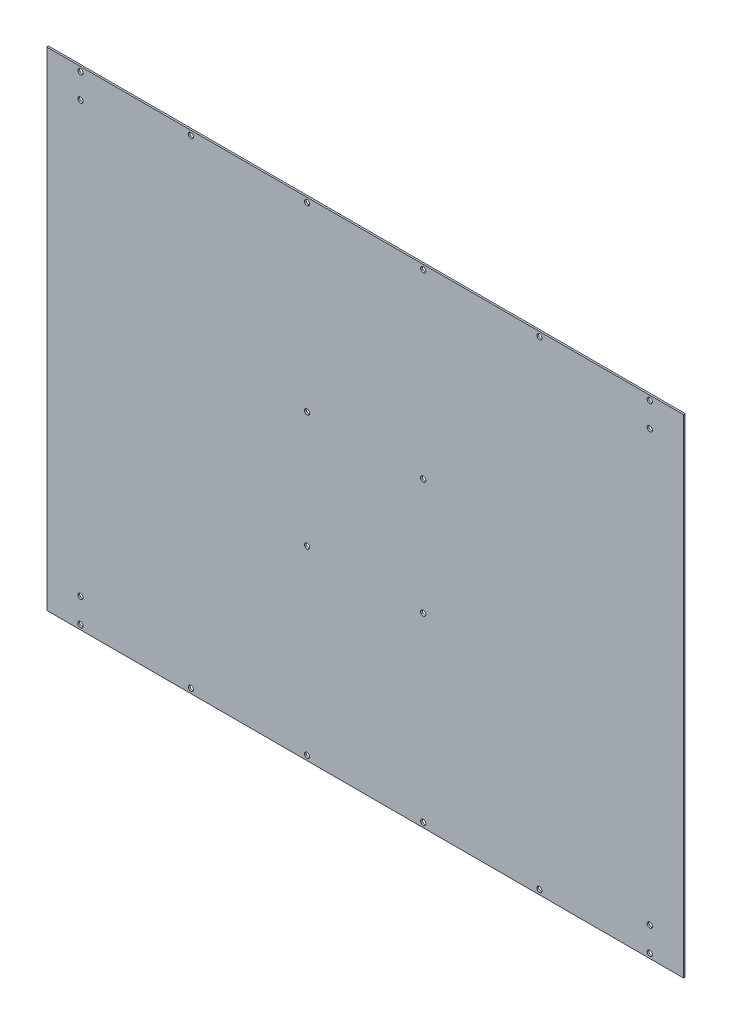
ISO-10303-21;
HEADER;
FILE_DESCRIPTION(('STEP AP214'),'2;1');
FILE_NAME('part.step','',(''),(''),'','','');
FILE_SCHEMA(('AUTOMOTIVE_DESIGN { 1 0 10303 214 1 1 1 1 }'));
ENDSEC;
DATA;
#1=APPLICATION_CONTEXT('core data for automotive mechanical design processes');
#2=APPLICATION_PROTOCOL_DEFINITION('international standard','automotive_design',2000,#1);
#3=PRODUCT_CONTEXT('',#1,'mechanical');
#4=PRODUCT('Part','Part','',(#3));
#5=PRODUCT_RELATED_PRODUCT_CATEGORY('part','',(#4));
#6=PRODUCT_DEFINITION_FORMATION('','',#4);
#7=PRODUCT_DEFINITION_CONTEXT('part definition',#1,'design');
#8=PRODUCT_DEFINITION('design','',#6,#7);
#9=PRODUCT_DEFINITION_SHAPE('','',#8);
#10=(LENGTH_UNIT() NAMED_UNIT(*) SI_UNIT(.MILLI.,.METRE.));
#11=(NAMED_UNIT(*) PLANE_ANGLE_UNIT() SI_UNIT($,.RADIAN.));
#12=(NAMED_UNIT(*) SI_UNIT($,.STERADIAN.) SOLID_ANGLE_UNIT());
#13=UNCERTAINTY_MEASURE_WITH_UNIT(LENGTH_MEASURE(1.E-05),#10,'distance_accuracy_value','');
#14=(GEOMETRIC_REPRESENTATION_CONTEXT(3) GLOBAL_UNCERTAINTY_ASSIGNED_CONTEXT((#13)) GLOBAL_UNIT_ASSIGNED_CONTEXT((#10,
#11,#12)) REPRESENTATION_CONTEXT('',''));
#15=CARTESIAN_POINT('',(0.,0.,0.));
#16=DIRECTION('',(0.,0.,1.));
#17=DIRECTION('',(1.,0.,0.));
#18=AXIS2_PLACEMENT_3D('',#15,#16,#17);
#19=CARTESIAN_POINT('',(0.,0.,110.));
#20=DIRECTION('',(0.,0.,1.));
#21=DIRECTION('',(1.,0.,0.));
#22=AXIS2_PLACEMENT_3D('',#19,#20,#21);
#23=PLANE('',#22);
#24=CARTESIAN_POINT('',(245.,185.,110.));
#25=DIRECTION('',(0.,0.,1.));
#26=DIRECTION('',(1.,0.,0.));
#27=AXIS2_PLACEMENT_3D('',#24,#25,#26);
#28=CIRCLE('',#27,2.25);
#29=CARTESIAN_POINT('',(247.25,185.,110.));
#30=VERTEX_POINT('',#29);
#31=EDGE_CURVE('E199',#30,#30,#28,.T.);
#32=ORIENTED_EDGE('',*,*,#31,.F.);
#33=EDGE_LOOP('',(#32));
#34=FACE_BOUND('',#33,.T.);
#35=CARTESIAN_POINT('',(245.,-185.,110.));
#36=DIRECTION('',(0.,0.,1.));
#37=DIRECTION('',(1.,0.,0.));
#38=AXIS2_PLACEMENT_3D('',#35,#36,#37);
#39=CIRCLE('',#38,2.25);
#40=CARTESIAN_POINT('',(247.25,-185.,110.));
#41=VERTEX_POINT('',#40);
#42=EDGE_CURVE('E196',#41,#41,#39,.T.);
#43=ORIENTED_EDGE('',*,*,#42,.F.);
#44=EDGE_LOOP('',(#43));
#45=FACE_BOUND('',#44,.T.);
#46=CARTESIAN_POINT('',(-245.,185.,110.));
#47=DIRECTION('',(0.,0.,1.));
#48=DIRECTION('',(1.,0.,0.));
#49=AXIS2_PLACEMENT_3D('',#46,#47,#48);
#50=CIRCLE('',#49,2.25);
#51=CARTESIAN_POINT('',(-242.75,185.,110.));
#52=VERTEX_POINT('',#51);
#53=EDGE_CURVE('E192',#52,#52,#50,.T.);
#54=ORIENTED_EDGE('',*,*,#53,.F.);
#55=EDGE_LOOP('',(#54));
#56=FACE_BOUND('',#55,.T.);
#57=CARTESIAN_POINT('',(-245.,-185.,110.));
#58=DIRECTION('',(0.,0.,1.));
#59=DIRECTION('',(1.,0.,0.));
#60=AXIS2_PLACEMENT_3D('',#57,#58,#59);
#61=CIRCLE('',#60,2.25);
#62=CARTESIAN_POINT('',(-242.75,-185.,110.));
#63=VERTEX_POINT('',#62);
#64=EDGE_CURVE('E187',#63,#63,#61,.T.);
#65=ORIENTED_EDGE('',*,*,#64,.F.);
#66=EDGE_LOOP('',(#65));
#67=FACE_BOUND('',#66,.T.);
#68=CARTESIAN_POINT('',(245.,206.,110.));
#69=DIRECTION('',(0.,0.,1.));
#70=DIRECTION('',(1.,0.,0.));
#71=AXIS2_PLACEMENT_3D('',#68,#69,#70);
#72=CIRCLE('',#71,2.25);
#73=CARTESIAN_POINT('',(247.25,206.,110.));
#74=VERTEX_POINT('',#73);
#75=EDGE_CURVE('E182',#74,#74,#72,.T.);
#76=ORIENTED_EDGE('',*,*,#75,.F.);
#77=EDGE_LOOP('',(#76));
#78=FACE_BOUND('',#77,.T.);
#79=CARTESIAN_POINT('',(245.,-206.,110.));
#80=DIRECTION('',(0.,0.,1.));
#81=DIRECTION('',(1.,0.,0.));
#82=AXIS2_PLACEMENT_3D('',#79,#80,#81);
#83=CIRCLE('',#82,2.25);
#84=CARTESIAN_POINT('',(247.25,-206.,110.));
#85=VERTEX_POINT('',#84);
#86=EDGE_CURVE('E177',#85,#85,#83,.T.);
#87=ORIENTED_EDGE('',*,*,#86,.F.);
#88=EDGE_LOOP('',(#87));
#89=FACE_BOUND('',#88,.T.);
#90=CARTESIAN_POINT('',(150.,206.,110.));
#91=DIRECTION('',(0.,0.,1.));
#92=DIRECTION('',(1.,0.,0.));
#93=AXIS2_PLACEMENT_3D('',#90,#91,#92);
#94=CIRCLE('',#93,2.25);
#95=CARTESIAN_POINT('',(152.25,206.,110.));
#96=VERTEX_POINT('',#95);
#97=EDGE_CURVE('E172',#96,#96,#94,.T.);
#98=ORIENTED_EDGE('',*,*,#97,.F.);
#99=EDGE_LOOP('',(#98));
#100=FACE_BOUND('',#99,.T.);
#101=CARTESIAN_POINT('',(150.,-206.,110.));
#102=DIRECTION('',(0.,0.,1.));
#103=DIRECTION('',(1.,0.,0.));
#104=AXIS2_PLACEMENT_3D('',#101,#102,#103);
#105=CIRCLE('',#104,2.25);
#106=CARTESIAN_POINT('',(152.25,-206.,110.));
#107=VERTEX_POINT('',#106);
#108=EDGE_CURVE('E167',#107,#107,#105,.T.);
#109=ORIENTED_EDGE('',*,*,#108,.F.);
#110=EDGE_LOOP('',(#109));
#111=FACE_BOUND('',#110,.T.);
#112=CARTESIAN_POINT('',(50.,206.,110.));
#113=DIRECTION('',(0.,0.,1.));
#114=DIRECTION('',(1.,0.,0.));
#115=AXIS2_PLACEMENT_3D('',#112,#113,#114);
#116=CIRCLE('',#115,2.25);
#117=CARTESIAN_POINT('',(52.25,206.,110.));
#118=VERTEX_POINT('',#117);
#119=EDGE_CURVE('E162',#118,#118,#116,.T.);
#120=ORIENTED_EDGE('',*,*,#119,.F.);
#121=EDGE_LOOP('',(#120));
#122=FACE_BOUND('',#121,.T.);
#123=CARTESIAN_POINT('',(50.,-206.,110.));
#124=DIRECTION('',(0.,0.,1.));
#125=DIRECTION('',(1.,0.,0.));
#126=AXIS2_PLACEMENT_3D('',#123,#124,#125);
#127=CIRCLE('',#126,2.25);
#128=CARTESIAN_POINT('',(52.25,-206.,110.));
#129=VERTEX_POINT('',#128);
#130=EDGE_CURVE('E157',#129,#129,#127,.T.);
#131=ORIENTED_EDGE('',*,*,#130,.F.);
#132=EDGE_LOOP('',(#131));
#133=FACE_BOUND('',#132,.T.);
#134=CARTESIAN_POINT('',(-50.,206.,110.));
#135=DIRECTION('',(0.,0.,1.));
#136=DIRECTION('',(1.,0.,0.));
#137=AXIS2_PLACEMENT_3D('',#134,#135,#136);
#138=CIRCLE('',#137,2.25);
#139=CARTESIAN_POINT('',(-47.75,206.,110.));
#140=VERTEX_POINT('',#139);
#141=EDGE_CURVE('E152',#140,#140,#138,.T.);
#142=ORIENTED_EDGE('',*,*,#141,.F.);
#143=EDGE_LOOP('',(#142));
#144=FACE_BOUND('',#143,.T.);
#145=CARTESIAN_POINT('',(-50.,-206.,110.));
#146=DIRECTION('',(0.,0.,1.));
#147=DIRECTION('',(1.,0.,0.));
#148=AXIS2_PLACEMENT_3D('',#145,#146,#147);
#149=CIRCLE('',#148,2.25);
#150=CARTESIAN_POINT('',(-47.75,-206.,110.));
#151=VERTEX_POINT('',#150);
#152=EDGE_CURVE('E147',#151,#151,#149,.T.);
#153=ORIENTED_EDGE('',*,*,#152,.F.);
#154=EDGE_LOOP('',(#153));
#155=FACE_BOUND('',#154,.T.);
#156=CARTESIAN_POINT('',(-150.,206.,110.));
#157=DIRECTION('',(0.,0.,1.));
#158=DIRECTION('',(1.,0.,0.));
#159=AXIS2_PLACEMENT_3D('',#156,#157,#158);
#160=CIRCLE('',#159,2.25);
#161=CARTESIAN_POINT('',(-147.75,206.,110.));
#162=VERTEX_POINT('',#161);
#163=EDGE_CURVE('E142',#162,#162,#160,.T.);
#164=ORIENTED_EDGE('',*,*,#163,.F.);
#165=EDGE_LOOP('',(#164));
#166=FACE_BOUND('',#165,.T.);
#167=CARTESIAN_POINT('',(-150.,-206.,110.));
#168=DIRECTION('',(0.,0.,1.));
#169=DIRECTION('',(1.,0.,0.));
#170=AXIS2_PLACEMENT_3D('',#167,#168,#169);
#171=CIRCLE('',#170,2.25);
#172=CARTESIAN_POINT('',(-147.75,-206.,110.));
#173=VERTEX_POINT('',#172);
#174=EDGE_CURVE('E137',#173,#173,#171,.T.);
#175=ORIENTED_EDGE('',*,*,#174,.F.);
#176=EDGE_LOOP('',(#175));
#177=FACE_BOUND('',#176,.T.);
#178=CARTESIAN_POINT('',(-245.,206.,110.));
#179=DIRECTION('',(0.,0.,1.));
#180=DIRECTION('',(1.,0.,0.));
#181=AXIS2_PLACEMENT_3D('',#178,#179,#180);
#182=CIRCLE('',#181,2.25);
#183=CARTESIAN_POINT('',(-242.75,206.,110.));
#184=VERTEX_POINT('',#183);
#185=EDGE_CURVE('E132',#184,#184,#182,.T.);
#186=ORIENTED_EDGE('',*,*,#185,.F.);
#187=EDGE_LOOP('',(#186));
#188=FACE_BOUND('',#187,.T.);
#189=CARTESIAN_POINT('',(-245.,-206.,110.));
#190=DIRECTION('',(0.,0.,1.));
#191=DIRECTION('',(1.,0.,0.));
#192=AXIS2_PLACEMENT_3D('',#189,#190,#191);
#193=CIRCLE('',#192,2.25);
#194=CARTESIAN_POINT('',(-242.75,-206.,110.));
#195=VERTEX_POINT('',#194);
#196=EDGE_CURVE('E127',#195,#195,#193,.T.);
#197=ORIENTED_EDGE('',*,*,#196,.F.);
#198=EDGE_LOOP('',(#197));
#199=FACE_BOUND('',#198,.T.);
#200=CARTESIAN_POINT('',(50.,50.,110.));
#201=DIRECTION('',(0.,0.,1.));
#202=DIRECTION('',(1.,0.,0.));
#203=AXIS2_PLACEMENT_3D('',#200,#201,#202);
#204=CIRCLE('',#203,2.25);
#205=CARTESIAN_POINT('',(52.25,50.,110.));
#206=VERTEX_POINT('',#205);
#207=EDGE_CURVE('E122',#206,#206,#204,.T.);
#208=ORIENTED_EDGE('',*,*,#207,.F.);
#209=EDGE_LOOP('',(#208));
#210=FACE_BOUND('',#209,.T.);
#211=CARTESIAN_POINT('',(50.,-50.,110.));
#212=DIRECTION('',(0.,0.,1.));
#213=DIRECTION('',(1.,0.,0.));
#214=AXIS2_PLACEMENT_3D('',#211,#212,#213);
#215=CIRCLE('',#214,2.25);
#216=CARTESIAN_POINT('',(52.25,-50.,110.));
#217=VERTEX_POINT('',#216);
#218=EDGE_CURVE('E117',#217,#217,#215,.T.);
#219=ORIENTED_EDGE('',*,*,#218,.F.);
#220=EDGE_LOOP('',(#219));
#221=FACE_BOUND('',#220,.T.);
#222=CARTESIAN_POINT('',(-50.,50.,110.));
#223=DIRECTION('',(0.,0.,1.));
#224=DIRECTION('',(1.,0.,0.));
#225=AXIS2_PLACEMENT_3D('',#222,#223,#224);
#226=CIRCLE('',#225,2.25);
#227=CARTESIAN_POINT('',(-47.75,50.,110.));
#228=VERTEX_POINT('',#227);
#229=EDGE_CURVE('E112',#228,#228,#226,.T.);
#230=ORIENTED_EDGE('',*,*,#229,.F.);
#231=EDGE_LOOP('',(#230));
#232=FACE_BOUND('',#231,.T.);
#233=CARTESIAN_POINT('',(-50.,-50.,110.));
#234=DIRECTION('',(0.,0.,1.));
#235=DIRECTION('',(1.,0.,0.));
#236=AXIS2_PLACEMENT_3D('',#233,#234,#235);
#237=CIRCLE('',#236,2.25);
#238=CARTESIAN_POINT('',(-47.75,-50.,110.));
#239=VERTEX_POINT('',#238);
#240=EDGE_CURVE('E76',#239,#239,#237,.T.);
#241=ORIENTED_EDGE('',*,*,#240,.F.);
#242=EDGE_LOOP('',(#241));
#243=FACE_BOUND('',#242,.T.);
#244=DIRECTION('',(-1.,0.,0.));
#245=VECTOR('',#244,1.);
#246=CARTESIAN_POINT('',(0.,-210.,110.));
#247=LINE('',#246,#245);
#248=CARTESIAN_POINT('',(274.,-210.,110.));
#249=VERTEX_POINT('',#248);
#250=CARTESIAN_POINT('',(-274.,-210.,110.));
#251=VERTEX_POINT('',#250);
#252=EDGE_CURVE('E10',#249,#251,#247,.T.);
#253=ORIENTED_EDGE('',*,*,#252,.F.);
#254=DIRECTION('',(0.,-1.,0.));
#255=VECTOR('',#254,1.);
#256=CARTESIAN_POINT('',(274.,0.,110.));
#257=LINE('',#256,#255);
#258=CARTESIAN_POINT('',(274.,210.,110.));
#259=VERTEX_POINT('',#258);
#260=EDGE_CURVE('E63',#259,#249,#257,.T.);
#261=ORIENTED_EDGE('',*,*,#260,.F.);
#262=DIRECTION('',(1.,0.,0.));
#263=VECTOR('',#262,1.);
#264=CARTESIAN_POINT('',(0.,210.,110.));
#265=LINE('',#264,#263);
#266=CARTESIAN_POINT('',(-274.,210.,110.));
#267=VERTEX_POINT('',#266);
#268=EDGE_CURVE('E103',#267,#259,#265,.T.);
#269=ORIENTED_EDGE('',*,*,#268,.F.);
#270=DIRECTION('',(0.,1.,0.));
#271=VECTOR('',#270,1.);
#272=CARTESIAN_POINT('',(-274.,0.,110.));
#273=LINE('',#272,#271);
#274=EDGE_CURVE('E25',#251,#267,#273,.T.);
#275=ORIENTED_EDGE('',*,*,#274,.F.);
#276=EDGE_LOOP('',(#253,#261,#269,#275));
#277=FACE_BOUND('',#276,.T.);
#278=ADVANCED_FACE('F16',(#34,#45,#56,#67,#78,#89,#100,#111,#122,#133,#144,#155,#166,#177,#188,
#199,#210,#221,#232,#243,#277),#23,.T.);
#279=CARTESIAN_POINT('',(0.,-210.,108.5));
#280=DIRECTION('',(0.,-1.,0.));
#281=DIRECTION('',(0.,0.,-1.));
#282=AXIS2_PLACEMENT_3D('',#279,#280,#281);
#283=PLANE('',#282);
#284=DIRECTION('',(0.,0.,1.));
#285=VECTOR('',#284,1.);
#286=CARTESIAN_POINT('',(274.,-210.,108.5));
#287=LINE('',#286,#285);
#288=CARTESIAN_POINT('',(274.,-210.,108.5));
#289=VERTEX_POINT('',#288);
#290=EDGE_CURVE('E56',#289,#249,#287,.T.);
#291=ORIENTED_EDGE('',*,*,#290,.T.);
#292=ORIENTED_EDGE('',*,*,#252,.T.);
#293=DIRECTION('',(0.,0.,1.));
#294=VECTOR('',#293,1.);
#295=CARTESIAN_POINT('',(-274.,-210.,108.5));
#296=LINE('',#295,#294);
#297=CARTESIAN_POINT('',(-274.,-210.,108.5));
#298=VERTEX_POINT('',#297);
#299=EDGE_CURVE('E70',#298,#251,#296,.T.);
#300=ORIENTED_EDGE('',*,*,#299,.F.);
#301=DIRECTION('',(1.,0.,0.));
#302=VECTOR('',#301,1.);
#303=CARTESIAN_POINT('',(0.,-210.,108.5));
#304=LINE('',#303,#302);
#305=EDGE_CURVE('E68',#298,#289,#304,.T.);
#306=ORIENTED_EDGE('',*,*,#305,.T.);
#307=EDGE_LOOP('',(#291,#292,#300,#306));
#308=FACE_BOUND('',#307,.T.);
#309=ADVANCED_FACE('F69',(#308),#283,.T.);
#310=CARTESIAN_POINT('',(-274.,0.,108.5));
#311=DIRECTION('',(-1.,0.,0.));
#312=DIRECTION('',(0.,0.,1.));
#313=AXIS2_PLACEMENT_3D('',#310,#311,#312);
#314=PLANE('',#313);
#315=ORIENTED_EDGE('',*,*,#299,.T.);
#316=ORIENTED_EDGE('',*,*,#274,.T.);
#317=DIRECTION('',(0.,0.,1.));
#318=VECTOR('',#317,1.);
#319=CARTESIAN_POINT('',(-274.,210.,108.5));
#320=LINE('',#319,#318);
#321=CARTESIAN_POINT('',(-274.,210.,108.5));
#322=VERTEX_POINT('',#321);
#323=EDGE_CURVE('E95',#322,#267,#320,.T.);
#324=ORIENTED_EDGE('',*,*,#323,.F.);
#325=DIRECTION('',(0.,-1.,0.));
#326=VECTOR('',#325,1.);
#327=CARTESIAN_POINT('',(-274.,0.,108.5));
#328=LINE('',#327,#326);
#329=EDGE_CURVE('E75',#322,#298,#328,.T.);
#330=ORIENTED_EDGE('',*,*,#329,.T.);
#331=EDGE_LOOP('',(#315,#316,#324,#330));
#332=FACE_BOUND('',#331,.T.);
#333=ADVANCED_FACE('F272',(#332),#314,.T.);
#334=CARTESIAN_POINT('',(0.,210.,108.5));
#335=DIRECTION('',(0.,1.,0.));
#336=DIRECTION('',(0.,0.,1.));
#337=AXIS2_PLACEMENT_3D('',#334,#335,#336);
#338=PLANE('',#337);
#339=ORIENTED_EDGE('',*,*,#323,.T.);
#340=ORIENTED_EDGE('',*,*,#268,.T.);
#341=DIRECTION('',(0.,0.,1.));
#342=VECTOR('',#341,1.);
#343=CARTESIAN_POINT('',(274.,210.,108.5));
#344=LINE('',#343,#342);
#345=CARTESIAN_POINT('',(274.,210.,108.5));
#346=VERTEX_POINT('',#345);
#347=EDGE_CURVE('E65',#346,#259,#344,.T.);
#348=ORIENTED_EDGE('',*,*,#347,.F.);
#349=DIRECTION('',(-1.,0.,0.));
#350=VECTOR('',#349,1.);
#351=CARTESIAN_POINT('',(0.,210.,108.5));
#352=LINE('',#351,#350);
#353=EDGE_CURVE('E81',#346,#322,#352,.T.);
#354=ORIENTED_EDGE('',*,*,#353,.T.);
#355=EDGE_LOOP('',(#339,#340,#348,#354));
#356=FACE_BOUND('',#355,.T.);
#357=ADVANCED_FACE('F274',(#356),#338,.T.);
#358=CARTESIAN_POINT('',(0.,0.,108.5));
#359=DIRECTION('',(0.,0.,-1.));
#360=DIRECTION('',(-1.,0.,0.));
#361=AXIS2_PLACEMENT_3D('',#358,#359,#360);
#362=PLANE('',#361);
#363=CARTESIAN_POINT('',(245.,185.,108.5));
#364=DIRECTION('',(0.,0.,-1.));
#365=DIRECTION('',(-1.,0.,0.));
#366=AXIS2_PLACEMENT_3D('',#363,#364,#365);
#367=CIRCLE('',#366,2.25);
#368=CARTESIAN_POINT('',(242.75,185.,108.5));
#369=VERTEX_POINT('',#368);
#370=EDGE_CURVE('E19',#369,#369,#367,.T.);
#371=ORIENTED_EDGE('',*,*,#370,.F.);
#372=EDGE_LOOP('',(#371));
#373=FACE_BOUND('',#372,.T.);
#374=CARTESIAN_POINT('',(245.,-185.,108.5));
#375=DIRECTION('',(0.,0.,-1.));
#376=DIRECTION('',(-1.,0.,0.));
#377=AXIS2_PLACEMENT_3D('',#374,#375,#376);
#378=CIRCLE('',#377,2.25);
#379=CARTESIAN_POINT('',(242.75,-185.,108.5));
#380=VERTEX_POINT('',#379);
#381=EDGE_CURVE('E197',#380,#380,#378,.T.);
#382=ORIENTED_EDGE('',*,*,#381,.F.);
#383=EDGE_LOOP('',(#382));
#384=FACE_BOUND('',#383,.T.);
#385=CARTESIAN_POINT('',(-245.,185.,108.5));
#386=DIRECTION('',(0.,0.,-1.));
#387=DIRECTION('',(-1.,0.,0.));
#388=AXIS2_PLACEMENT_3D('',#385,#386,#387);
#389=CIRCLE('',#388,2.25);
#390=CARTESIAN_POINT('',(-247.25,185.,108.5));
#391=VERTEX_POINT('',#390);
#392=EDGE_CURVE('E193',#391,#391,#389,.T.);
#393=ORIENTED_EDGE('',*,*,#392,.F.);
#394=EDGE_LOOP('',(#393));
#395=FACE_BOUND('',#394,.T.);
#396=CARTESIAN_POINT('',(-245.,-185.,108.5));
#397=DIRECTION('',(0.,0.,-1.));
#398=DIRECTION('',(-1.,0.,0.));
#399=AXIS2_PLACEMENT_3D('',#396,#397,#398);
#400=CIRCLE('',#399,2.25);
#401=CARTESIAN_POINT('',(-247.25,-185.,108.5));
#402=VERTEX_POINT('',#401);
#403=EDGE_CURVE('E188',#402,#402,#400,.T.);
#404=ORIENTED_EDGE('',*,*,#403,.F.);
#405=EDGE_LOOP('',(#404));
#406=FACE_BOUND('',#405,.T.);
#407=CARTESIAN_POINT('',(245.,206.,108.5));
#408=DIRECTION('',(0.,0.,-1.));
#409=DIRECTION('',(-1.,0.,0.));
#410=AXIS2_PLACEMENT_3D('',#407,#408,#409);
#411=CIRCLE('',#410,2.25);
#412=CARTESIAN_POINT('',(242.75,206.,108.5));
#413=VERTEX_POINT('',#412);
#414=EDGE_CURVE('E183',#413,#413,#411,.T.);
#415=ORIENTED_EDGE('',*,*,#414,.F.);
#416=EDGE_LOOP('',(#415));
#417=FACE_BOUND('',#416,.T.);
#418=CARTESIAN_POINT('',(245.,-206.,108.5));
#419=DIRECTION('',(0.,0.,-1.));
#420=DIRECTION('',(-1.,0.,0.));
#421=AXIS2_PLACEMENT_3D('',#418,#419,#420);
#422=CIRCLE('',#421,2.25);
#423=CARTESIAN_POINT('',(242.75,-206.,108.5));
#424=VERTEX_POINT('',#423);
#425=EDGE_CURVE('E178',#424,#424,#422,.T.);
#426=ORIENTED_EDGE('',*,*,#425,.F.);
#427=EDGE_LOOP('',(#426));
#428=FACE_BOUND('',#427,.T.);
#429=CARTESIAN_POINT('',(150.,206.,108.5));
#430=DIRECTION('',(0.,0.,-1.));
#431=DIRECTION('',(-1.,0.,0.));
#432=AXIS2_PLACEMENT_3D('',#429,#430,#431);
#433=CIRCLE('',#432,2.25);
#434=CARTESIAN_POINT('',(147.75,206.,108.5));
#435=VERTEX_POINT('',#434);
#436=EDGE_CURVE('E173',#435,#435,#433,.T.);
#437=ORIENTED_EDGE('',*,*,#436,.F.);
#438=EDGE_LOOP('',(#437));
#439=FACE_BOUND('',#438,.T.);
#440=CARTESIAN_POINT('',(150.,-206.,108.5));
#441=DIRECTION('',(0.,0.,-1.));
#442=DIRECTION('',(-1.,0.,0.));
#443=AXIS2_PLACEMENT_3D('',#440,#441,#442);
#444=CIRCLE('',#443,2.25);
#445=CARTESIAN_POINT('',(147.75,-206.,108.5));
#446=VERTEX_POINT('',#445);
#447=EDGE_CURVE('E168',#446,#446,#444,.T.);
#448=ORIENTED_EDGE('',*,*,#447,.F.);
#449=EDGE_LOOP('',(#448));
#450=FACE_BOUND('',#449,.T.);
#451=CARTESIAN_POINT('',(50.,206.,108.5));
#452=DIRECTION('',(0.,0.,-1.));
#453=DIRECTION('',(-1.,0.,0.));
#454=AXIS2_PLACEMENT_3D('',#451,#452,#453);
#455=CIRCLE('',#454,2.25);
#456=CARTESIAN_POINT('',(47.75,206.,108.5));
#457=VERTEX_POINT('',#456);
#458=EDGE_CURVE('E163',#457,#457,#455,.T.);
#459=ORIENTED_EDGE('',*,*,#458,.F.);
#460=EDGE_LOOP('',(#459));
#461=FACE_BOUND('',#460,.T.);
#462=CARTESIAN_POINT('',(50.,-206.,108.5));
#463=DIRECTION('',(0.,0.,-1.));
#464=DIRECTION('',(-1.,0.,0.));
#465=AXIS2_PLACEMENT_3D('',#462,#463,#464);
#466=CIRCLE('',#465,2.25);
#467=CARTESIAN_POINT('',(47.75,-206.,108.5));
#468=VERTEX_POINT('',#467);
#469=EDGE_CURVE('E158',#468,#468,#466,.T.);
#470=ORIENTED_EDGE('',*,*,#469,.F.);
#471=EDGE_LOOP('',(#470));
#472=FACE_BOUND('',#471,.T.);
#473=CARTESIAN_POINT('',(-50.,206.,108.5));
#474=DIRECTION('',(0.,0.,-1.));
#475=DIRECTION('',(-1.,0.,0.));
#476=AXIS2_PLACEMENT_3D('',#473,#474,#475);
#477=CIRCLE('',#476,2.25);
#478=CARTESIAN_POINT('',(-52.25,206.,108.5));
#479=VERTEX_POINT('',#478);
#480=EDGE_CURVE('E153',#479,#479,#477,.T.);
#481=ORIENTED_EDGE('',*,*,#480,.F.);
#482=EDGE_LOOP('',(#481));
#483=FACE_BOUND('',#482,.T.);
#484=CARTESIAN_POINT('',(-50.,-206.,108.5));
#485=DIRECTION('',(0.,0.,-1.));
#486=DIRECTION('',(-1.,0.,0.));
#487=AXIS2_PLACEMENT_3D('',#484,#485,#486);
#488=CIRCLE('',#487,2.25);
#489=CARTESIAN_POINT('',(-52.25,-206.,108.5));
#490=VERTEX_POINT('',#489);
#491=EDGE_CURVE('E148',#490,#490,#488,.T.);
#492=ORIENTED_EDGE('',*,*,#491,.F.);
#493=EDGE_LOOP('',(#492));
#494=FACE_BOUND('',#493,.T.);
#495=CARTESIAN_POINT('',(-150.,206.,108.5));
#496=DIRECTION('',(0.,0.,-1.));
#497=DIRECTION('',(-1.,0.,0.));
#498=AXIS2_PLACEMENT_3D('',#495,#496,#497);
#499=CIRCLE('',#498,2.25);
#500=CARTESIAN_POINT('',(-152.25,206.,108.5));
#501=VERTEX_POINT('',#500);
#502=EDGE_CURVE('E143',#501,#501,#499,.T.);
#503=ORIENTED_EDGE('',*,*,#502,.F.);
#504=EDGE_LOOP('',(#503));
#505=FACE_BOUND('',#504,.T.);
#506=CARTESIAN_POINT('',(-150.,-206.,108.5));
#507=DIRECTION('',(0.,0.,-1.));
#508=DIRECTION('',(-1.,0.,0.));
#509=AXIS2_PLACEMENT_3D('',#506,#507,#508);
#510=CIRCLE('',#509,2.25);
#511=CARTESIAN_POINT('',(-152.25,-206.,108.5));
#512=VERTEX_POINT('',#511);
#513=EDGE_CURVE('E138',#512,#512,#510,.T.);
#514=ORIENTED_EDGE('',*,*,#513,.F.);
#515=EDGE_LOOP('',(#514));
#516=FACE_BOUND('',#515,.T.);
#517=CARTESIAN_POINT('',(-245.,206.,108.5));
#518=DIRECTION('',(0.,0.,-1.));
#519=DIRECTION('',(-1.,0.,0.));
#520=AXIS2_PLACEMENT_3D('',#517,#518,#519);
#521=CIRCLE('',#520,2.25);
#522=CARTESIAN_POINT('',(-247.25,206.,108.5));
#523=VERTEX_POINT('',#522);
#524=EDGE_CURVE('E133',#523,#523,#521,.T.);
#525=ORIENTED_EDGE('',*,*,#524,.F.);
#526=EDGE_LOOP('',(#525));
#527=FACE_BOUND('',#526,.T.);
#528=CARTESIAN_POINT('',(-245.,-206.,108.5));
#529=DIRECTION('',(0.,0.,-1.));
#530=DIRECTION('',(-1.,0.,0.));
#531=AXIS2_PLACEMENT_3D('',#528,#529,#530);
#532=CIRCLE('',#531,2.25);
#533=CARTESIAN_POINT('',(-247.25,-206.,108.5));
#534=VERTEX_POINT('',#533);
#535=EDGE_CURVE('E128',#534,#534,#532,.T.);
#536=ORIENTED_EDGE('',*,*,#535,.F.);
#537=EDGE_LOOP('',(#536));
#538=FACE_BOUND('',#537,.T.);
#539=CARTESIAN_POINT('',(50.,50.,108.5));
#540=DIRECTION('',(0.,0.,-1.));
#541=DIRECTION('',(-1.,0.,0.));
#542=AXIS2_PLACEMENT_3D('',#539,#540,#541);
#543=CIRCLE('',#542,2.25);
#544=CARTESIAN_POINT('',(47.75,50.,108.5));
#545=VERTEX_POINT('',#544);
#546=EDGE_CURVE('E123',#545,#545,#543,.T.);
#547=ORIENTED_EDGE('',*,*,#546,.F.);
#548=EDGE_LOOP('',(#547));
#549=FACE_BOUND('',#548,.T.);
#550=CARTESIAN_POINT('',(50.,-50.,108.5));
#551=DIRECTION('',(0.,0.,-1.));
#552=DIRECTION('',(-1.,0.,0.));
#553=AXIS2_PLACEMENT_3D('',#550,#551,#552);
#554=CIRCLE('',#553,2.25);
#555=CARTESIAN_POINT('',(47.75,-50.,108.5));
#556=VERTEX_POINT('',#555);
#557=EDGE_CURVE('E118',#556,#556,#554,.T.);
#558=ORIENTED_EDGE('',*,*,#557,.F.);
#559=EDGE_LOOP('',(#558));
#560=FACE_BOUND('',#559,.T.);
#561=CARTESIAN_POINT('',(-50.,50.,108.5));
#562=DIRECTION('',(0.,0.,-1.));
#563=DIRECTION('',(-1.,0.,0.));
#564=AXIS2_PLACEMENT_3D('',#561,#562,#563);
#565=CIRCLE('',#564,2.25);
#566=CARTESIAN_POINT('',(-52.25,50.,108.5));
#567=VERTEX_POINT('',#566);
#568=EDGE_CURVE('E113',#567,#567,#565,.T.);
#569=ORIENTED_EDGE('',*,*,#568,.F.);
#570=EDGE_LOOP('',(#569));
#571=FACE_BOUND('',#570,.T.);
#572=CARTESIAN_POINT('',(-50.,-50.,108.5));
#573=DIRECTION('',(0.,0.,-1.));
#574=DIRECTION('',(-1.,0.,0.));
#575=AXIS2_PLACEMENT_3D('',#572,#573,#574);
#576=CIRCLE('',#575,2.25);
#577=CARTESIAN_POINT('',(-52.25,-50.,108.5));
#578=VERTEX_POINT('',#577);
#579=EDGE_CURVE('E108',#578,#578,#576,.T.);
#580=ORIENTED_EDGE('',*,*,#579,.F.);
#581=EDGE_LOOP('',(#580));
#582=FACE_BOUND('',#581,.T.);
#583=DIRECTION('',(0.,1.,0.));
#584=VECTOR('',#583,1.);
#585=CARTESIAN_POINT('',(274.,0.,108.5));
#586=LINE('',#585,#584);
#587=EDGE_CURVE('E61',#289,#346,#586,.T.);
#588=ORIENTED_EDGE('',*,*,#587,.F.);
#589=ORIENTED_EDGE('',*,*,#305,.F.);
#590=ORIENTED_EDGE('',*,*,#329,.F.);
#591=ORIENTED_EDGE('',*,*,#353,.F.);
#592=EDGE_LOOP('',(#588,#589,#590,#591));
#593=FACE_BOUND('',#592,.T.);
#594=ADVANCED_FACE('F79',(#373,#384,#395,#406,#417,#428,#439,#450,#461,#472,#483,#494,#505,#516,
#527,#538,#549,#560,#571,#582,#593),#362,.T.);
#595=CARTESIAN_POINT('',(274.,0.,108.5));
#596=DIRECTION('',(1.,0.,0.));
#597=DIRECTION('',(0.,0.,-1.));
#598=AXIS2_PLACEMENT_3D('',#595,#596,#597);
#599=PLANE('',#598);
#600=ORIENTED_EDGE('',*,*,#587,.T.);
#601=ORIENTED_EDGE('',*,*,#347,.T.);
#602=ORIENTED_EDGE('',*,*,#260,.T.);
#603=ORIENTED_EDGE('',*,*,#290,.F.);
#604=EDGE_LOOP('',(#600,#601,#602,#603));
#605=FACE_BOUND('',#604,.T.);
#606=ADVANCED_FACE('F58',(#605),#599,.T.);
#607=CARTESIAN_POINT('',(-50.,-50.,107.7));
#608=DIRECTION('',(0.,0.,1.));
#609=DIRECTION('',(1.,0.,0.));
#610=AXIS2_PLACEMENT_3D('',#607,#608,#609);
#611=CYLINDRICAL_SURFACE('',#610,2.25);
#612=ORIENTED_EDGE('',*,*,#240,.T.);
#613=EDGE_LOOP('',(#612));
#614=FACE_BOUND('',#613,.T.);
#615=ORIENTED_EDGE('',*,*,#579,.T.);
#616=EDGE_LOOP('',(#615));
#617=FACE_BOUND('',#616,.T.);
#618=ADVANCED_FACE('F266',(#614,#617),#611,.F.);
#619=CARTESIAN_POINT('',(-50.,50.,107.7));
#620=DIRECTION('',(0.,0.,1.));
#621=DIRECTION('',(1.,0.,0.));
#622=AXIS2_PLACEMENT_3D('',#619,#620,#621);
#623=CYLINDRICAL_SURFACE('',#622,2.25);
#624=ORIENTED_EDGE('',*,*,#229,.T.);
#625=EDGE_LOOP('',(#624));
#626=FACE_BOUND('',#625,.T.);
#627=ORIENTED_EDGE('',*,*,#568,.T.);
#628=EDGE_LOOP('',(#627));
#629=FACE_BOUND('',#628,.T.);
#630=ADVANCED_FACE('F315',(#626,#629),#623,.F.);
#631=CARTESIAN_POINT('',(50.,-50.,107.7));
#632=DIRECTION('',(0.,0.,1.));
#633=DIRECTION('',(1.,0.,0.));
#634=AXIS2_PLACEMENT_3D('',#631,#632,#633);
#635=CYLINDRICAL_SURFACE('',#634,2.25);
#636=ORIENTED_EDGE('',*,*,#218,.T.);
#637=EDGE_LOOP('',(#636));
#638=FACE_BOUND('',#637,.T.);
#639=ORIENTED_EDGE('',*,*,#557,.T.);
#640=EDGE_LOOP('',(#639));
#641=FACE_BOUND('',#640,.T.);
#642=ADVANCED_FACE('F322',(#638,#641),#635,.F.);
#643=CARTESIAN_POINT('',(50.,50.,107.7));
#644=DIRECTION('',(0.,0.,1.));
#645=DIRECTION('',(1.,0.,0.));
#646=AXIS2_PLACEMENT_3D('',#643,#644,#645);
#647=CYLINDRICAL_SURFACE('',#646,2.25);
#648=ORIENTED_EDGE('',*,*,#207,.T.);
#649=EDGE_LOOP('',(#648));
#650=FACE_BOUND('',#649,.T.);
#651=ORIENTED_EDGE('',*,*,#546,.T.);
#652=EDGE_LOOP('',(#651));
#653=FACE_BOUND('',#652,.T.);
#654=ADVANCED_FACE('F330',(#650,#653),#647,.F.);
#655=CARTESIAN_POINT('',(-245.,-206.,107.7));
#656=DIRECTION('',(0.,0.,1.));
#657=DIRECTION('',(1.,0.,0.));
#658=AXIS2_PLACEMENT_3D('',#655,#656,#657);
#659=CYLINDRICAL_SURFACE('',#658,2.25);
#660=ORIENTED_EDGE('',*,*,#196,.T.);
#661=EDGE_LOOP('',(#660));
#662=FACE_BOUND('',#661,.T.);
#663=ORIENTED_EDGE('',*,*,#535,.T.);
#664=EDGE_LOOP('',(#663));
#665=FACE_BOUND('',#664,.T.);
#666=ADVANCED_FACE('F338',(#662,#665),#659,.F.);
#667=CARTESIAN_POINT('',(-245.,206.,107.7));
#668=DIRECTION('',(0.,0.,1.));
#669=DIRECTION('',(1.,0.,0.));
#670=AXIS2_PLACEMENT_3D('',#667,#668,#669);
#671=CYLINDRICAL_SURFACE('',#670,2.25);
#672=ORIENTED_EDGE('',*,*,#185,.T.);
#673=EDGE_LOOP('',(#672));
#674=FACE_BOUND('',#673,.T.);
#675=ORIENTED_EDGE('',*,*,#524,.T.);
#676=EDGE_LOOP('',(#675));
#677=FACE_BOUND('',#676,.T.);
#678=ADVANCED_FACE('F346',(#674,#677),#671,.F.);
#679=CARTESIAN_POINT('',(-150.,-206.,107.7));
#680=DIRECTION('',(0.,0.,1.));
#681=DIRECTION('',(1.,0.,0.));
#682=AXIS2_PLACEMENT_3D('',#679,#680,#681);
#683=CYLINDRICAL_SURFACE('',#682,2.25);
#684=ORIENTED_EDGE('',*,*,#174,.T.);
#685=EDGE_LOOP('',(#684));
#686=FACE_BOUND('',#685,.T.);
#687=ORIENTED_EDGE('',*,*,#513,.T.);
#688=EDGE_LOOP('',(#687));
#689=FACE_BOUND('',#688,.T.);
#690=ADVANCED_FACE('F354',(#686,#689),#683,.F.);
#691=CARTESIAN_POINT('',(-150.,206.,107.7));
#692=DIRECTION('',(0.,0.,1.));
#693=DIRECTION('',(1.,0.,0.));
#694=AXIS2_PLACEMENT_3D('',#691,#692,#693);
#695=CYLINDRICAL_SURFACE('',#694,2.25);
#696=ORIENTED_EDGE('',*,*,#163,.T.);
#697=EDGE_LOOP('',(#696));
#698=FACE_BOUND('',#697,.T.);
#699=ORIENTED_EDGE('',*,*,#502,.T.);
#700=EDGE_LOOP('',(#699));
#701=FACE_BOUND('',#700,.T.);
#702=ADVANCED_FACE('F362',(#698,#701),#695,.F.);
#703=CARTESIAN_POINT('',(-50.,-206.,107.7));
#704=DIRECTION('',(0.,0.,1.));
#705=DIRECTION('',(1.,0.,0.));
#706=AXIS2_PLACEMENT_3D('',#703,#704,#705);
#707=CYLINDRICAL_SURFACE('',#706,2.25);
#708=ORIENTED_EDGE('',*,*,#152,.T.);
#709=EDGE_LOOP('',(#708));
#710=FACE_BOUND('',#709,.T.);
#711=ORIENTED_EDGE('',*,*,#491,.T.);
#712=EDGE_LOOP('',(#711));
#713=FACE_BOUND('',#712,.T.);
#714=ADVANCED_FACE('F370',(#710,#713),#707,.F.);
#715=CARTESIAN_POINT('',(-50.,206.,107.7));
#716=DIRECTION('',(0.,0.,1.));
#717=DIRECTION('',(1.,0.,0.));
#718=AXIS2_PLACEMENT_3D('',#715,#716,#717);
#719=CYLINDRICAL_SURFACE('',#718,2.25);
#720=ORIENTED_EDGE('',*,*,#141,.T.);
#721=EDGE_LOOP('',(#720));
#722=FACE_BOUND('',#721,.T.);
#723=ORIENTED_EDGE('',*,*,#480,.T.);
#724=EDGE_LOOP('',(#723));
#725=FACE_BOUND('',#724,.T.);
#726=ADVANCED_FACE('F378',(#722,#725),#719,.F.);
#727=CARTESIAN_POINT('',(50.,-206.,107.7));
#728=DIRECTION('',(0.,0.,1.));
#729=DIRECTION('',(1.,0.,0.));
#730=AXIS2_PLACEMENT_3D('',#727,#728,#729);
#731=CYLINDRICAL_SURFACE('',#730,2.25);
#732=ORIENTED_EDGE('',*,*,#130,.T.);
#733=EDGE_LOOP('',(#732));
#734=FACE_BOUND('',#733,.T.);
#735=ORIENTED_EDGE('',*,*,#469,.T.);
#736=EDGE_LOOP('',(#735));
#737=FACE_BOUND('',#736,.T.);
#738=ADVANCED_FACE('F386',(#734,#737),#731,.F.);
#739=CARTESIAN_POINT('',(50.,206.,107.7));
#740=DIRECTION('',(0.,0.,1.));
#741=DIRECTION('',(1.,0.,0.));
#742=AXIS2_PLACEMENT_3D('',#739,#740,#741);
#743=CYLINDRICAL_SURFACE('',#742,2.25);
#744=ORIENTED_EDGE('',*,*,#119,.T.);
#745=EDGE_LOOP('',(#744));
#746=FACE_BOUND('',#745,.T.);
#747=ORIENTED_EDGE('',*,*,#458,.T.);
#748=EDGE_LOOP('',(#747));
#749=FACE_BOUND('',#748,.T.);
#750=ADVANCED_FACE('F394',(#746,#749),#743,.F.);
#751=CARTESIAN_POINT('',(150.,-206.,107.7));
#752=DIRECTION('',(0.,0.,1.));
#753=DIRECTION('',(1.,0.,0.));
#754=AXIS2_PLACEMENT_3D('',#751,#752,#753);
#755=CYLINDRICAL_SURFACE('',#754,2.25);
#756=ORIENTED_EDGE('',*,*,#108,.T.);
#757=EDGE_LOOP('',(#756));
#758=FACE_BOUND('',#757,.T.);
#759=ORIENTED_EDGE('',*,*,#447,.T.);
#760=EDGE_LOOP('',(#759));
#761=FACE_BOUND('',#760,.T.);
#762=ADVANCED_FACE('F402',(#758,#761),#755,.F.);
#763=CARTESIAN_POINT('',(150.,206.,107.7));
#764=DIRECTION('',(0.,0.,1.));
#765=DIRECTION('',(1.,0.,0.));
#766=AXIS2_PLACEMENT_3D('',#763,#764,#765);
#767=CYLINDRICAL_SURFACE('',#766,2.25);
#768=ORIENTED_EDGE('',*,*,#97,.T.);
#769=EDGE_LOOP('',(#768));
#770=FACE_BOUND('',#769,.T.);
#771=ORIENTED_EDGE('',*,*,#436,.T.);
#772=EDGE_LOOP('',(#771));
#773=FACE_BOUND('',#772,.T.);
#774=ADVANCED_FACE('F410',(#770,#773),#767,.F.);
#775=CARTESIAN_POINT('',(245.,-206.,107.7));
#776=DIRECTION('',(0.,0.,1.));
#777=DIRECTION('',(1.,0.,0.));
#778=AXIS2_PLACEMENT_3D('',#775,#776,#777);
#779=CYLINDRICAL_SURFACE('',#778,2.25);
#780=ORIENTED_EDGE('',*,*,#86,.T.);
#781=EDGE_LOOP('',(#780));
#782=FACE_BOUND('',#781,.T.);
#783=ORIENTED_EDGE('',*,*,#425,.T.);
#784=EDGE_LOOP('',(#783));
#785=FACE_BOUND('',#784,.T.);
#786=ADVANCED_FACE('F418',(#782,#785),#779,.F.);
#787=CARTESIAN_POINT('',(245.,206.,107.7));
#788=DIRECTION('',(0.,0.,1.));
#789=DIRECTION('',(1.,0.,0.));
#790=AXIS2_PLACEMENT_3D('',#787,#788,#789);
#791=CYLINDRICAL_SURFACE('',#790,2.25);
#792=ORIENTED_EDGE('',*,*,#75,.T.);
#793=EDGE_LOOP('',(#792));
#794=FACE_BOUND('',#793,.T.);
#795=ORIENTED_EDGE('',*,*,#414,.T.);
#796=EDGE_LOOP('',(#795));
#797=FACE_BOUND('',#796,.T.);
#798=ADVANCED_FACE('F426',(#794,#797),#791,.F.);
#799=CARTESIAN_POINT('',(-245.,-185.,107.7));
#800=DIRECTION('',(0.,0.,1.));
#801=DIRECTION('',(1.,0.,0.));
#802=AXIS2_PLACEMENT_3D('',#799,#800,#801);
#803=CYLINDRICAL_SURFACE('',#802,2.25);
#804=ORIENTED_EDGE('',*,*,#64,.T.);
#805=EDGE_LOOP('',(#804));
#806=FACE_BOUND('',#805,.T.);
#807=ORIENTED_EDGE('',*,*,#403,.T.);
#808=EDGE_LOOP('',(#807));
#809=FACE_BOUND('',#808,.T.);
#810=ADVANCED_FACE('F434',(#806,#809),#803,.F.);
#811=CARTESIAN_POINT('',(-245.,185.,107.7));
#812=DIRECTION('',(0.,0.,1.));
#813=DIRECTION('',(1.,0.,0.));
#814=AXIS2_PLACEMENT_3D('',#811,#812,#813);
#815=CYLINDRICAL_SURFACE('',#814,2.25);
#816=ORIENTED_EDGE('',*,*,#53,.T.);
#817=EDGE_LOOP('',(#816));
#818=FACE_BOUND('',#817,.T.);
#819=ORIENTED_EDGE('',*,*,#392,.T.);
#820=EDGE_LOOP('',(#819));
#821=FACE_BOUND('',#820,.T.);
#822=ADVANCED_FACE('F442',(#818,#821),#815,.F.);
#823=CARTESIAN_POINT('',(245.,-185.,107.7));
#824=DIRECTION('',(0.,0.,1.));
#825=DIRECTION('',(1.,0.,0.));
#826=AXIS2_PLACEMENT_3D('',#823,#824,#825);
#827=CYLINDRICAL_SURFACE('',#826,2.25);
#828=ORIENTED_EDGE('',*,*,#42,.T.);
#829=EDGE_LOOP('',(#828));
#830=FACE_BOUND('',#829,.T.);
#831=ORIENTED_EDGE('',*,*,#381,.T.);
#832=EDGE_LOOP('',(#831));
#833=FACE_BOUND('',#832,.T.);
#834=ADVANCED_FACE('F450',(#830,#833),#827,.F.);
#835=CARTESIAN_POINT('',(245.,185.,107.7));
#836=DIRECTION('',(0.,0.,1.));
#837=DIRECTION('',(1.,0.,0.));
#838=AXIS2_PLACEMENT_3D('',#835,#836,#837);
#839=CYLINDRICAL_SURFACE('',#838,2.25);
#840=ORIENTED_EDGE('',*,*,#31,.T.);
#841=EDGE_LOOP('',(#840));
#842=FACE_BOUND('',#841,.T.);
#843=ORIENTED_EDGE('',*,*,#370,.T.);
#844=EDGE_LOOP('',(#843));
#845=FACE_BOUND('',#844,.T.);
#846=ADVANCED_FACE('F458',(#842,#845),#839,.F.);
#847=CLOSED_SHELL('',(#278,#309,#333,#357,#594,#606,#618,#630,#642,#654,#666,#678,#690,#702,
#714,#726,#738,#750,#762,#774,#786,#798,#810,#822,#834,#846));
#848=MANIFOLD_SOLID_BREP('B1',#847);
#849=ADVANCED_BREP_SHAPE_REPRESENTATION('',(#18,#848),#14);
#850=SHAPE_DEFINITION_REPRESENTATION(#9,#849);
ENDSEC;
END-ISO-10303-21;
